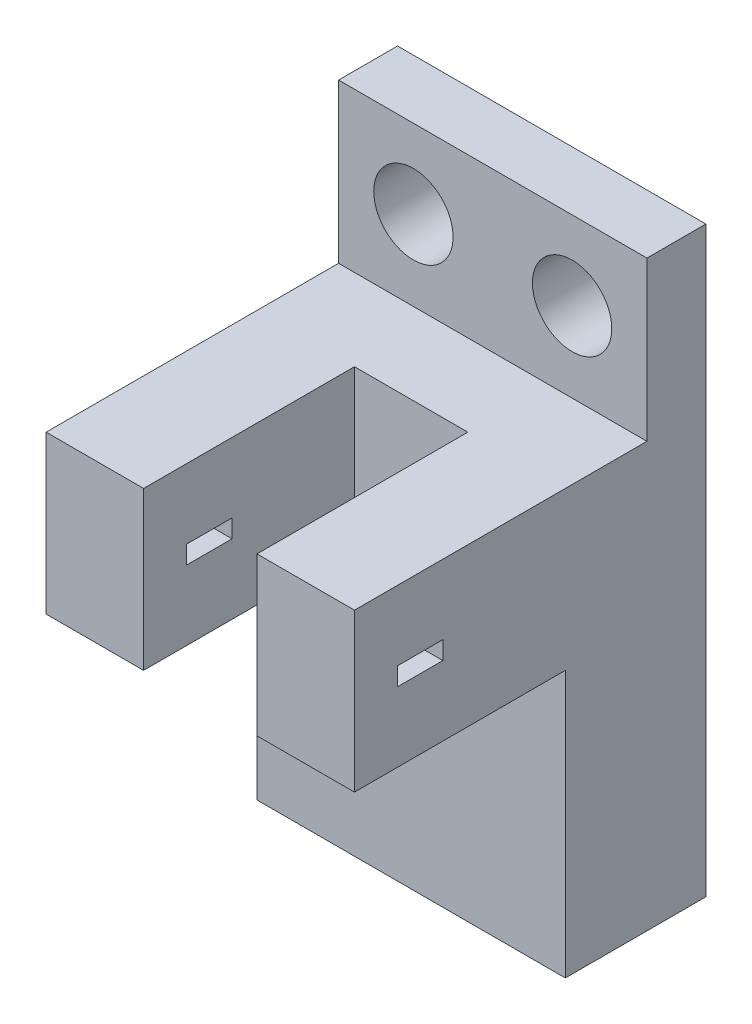
ISO-10303-21;
HEADER;
FILE_DESCRIPTION(('STEP AP214'),'2;1');
FILE_NAME('part.step','',(''),(''),'','','');
FILE_SCHEMA(('AUTOMOTIVE_DESIGN { 1 0 10303 214 1 1 1 1 }'));
ENDSEC;
DATA;
#1=APPLICATION_CONTEXT('core data for automotive mechanical design processes');
#2=APPLICATION_PROTOCOL_DEFINITION('international standard','automotive_design',2000,#1);
#3=PRODUCT_CONTEXT('',#1,'mechanical');
#4=PRODUCT('Part','Part','',(#3));
#5=PRODUCT_RELATED_PRODUCT_CATEGORY('part','',(#4));
#6=PRODUCT_DEFINITION_FORMATION('','',#4);
#7=PRODUCT_DEFINITION_CONTEXT('part definition',#1,'design');
#8=PRODUCT_DEFINITION('design','',#6,#7);
#9=PRODUCT_DEFINITION_SHAPE('','',#8);
#10=(LENGTH_UNIT() NAMED_UNIT(*) SI_UNIT(.MILLI.,.METRE.));
#11=(NAMED_UNIT(*) PLANE_ANGLE_UNIT() SI_UNIT($,.RADIAN.));
#12=(NAMED_UNIT(*) SI_UNIT($,.STERADIAN.) SOLID_ANGLE_UNIT());
#13=UNCERTAINTY_MEASURE_WITH_UNIT(LENGTH_MEASURE(1.E-05),#10,'distance_accuracy_value','');
#14=(GEOMETRIC_REPRESENTATION_CONTEXT(3) GLOBAL_UNCERTAINTY_ASSIGNED_CONTEXT((#13)) GLOBAL_UNIT_ASSIGNED_CONTEXT((#10,
#11,#12)) REPRESENTATION_CONTEXT('',''));
#15=CARTESIAN_POINT('',(0.,0.,0.));
#16=DIRECTION('',(0.,0.,1.));
#17=DIRECTION('',(1.,0.,0.));
#18=AXIS2_PLACEMENT_3D('',#15,#16,#17);
#19=CARTESIAN_POINT('',(0.,0.,6.2));
#20=DIRECTION('',(0.,0.,-1.));
#21=DIRECTION('',(-1.,0.,0.));
#22=AXIS2_PLACEMENT_3D('',#19,#20,#21);
#23=PLANE('',#22);
#24=DIRECTION('',(0.,-1.,0.));
#25=VECTOR('',#24,1.);
#26=CARTESIAN_POINT('',(2.5,1.65,6.2));
#27=LINE('',#26,#25);
#28=CARTESIAN_POINT('',(2.5,8.6,6.2));
#29=VERTEX_POINT('',#28);
#30=CARTESIAN_POINT('',(2.5,1.65,6.2));
#31=VERTEX_POINT('',#30);
#32=EDGE_CURVE('E258',#29,#31,#27,.T.);
#33=ORIENTED_EDGE('',*,*,#32,.F.);
#34=DIRECTION('',(-1.,0.,0.));
#35=VECTOR('',#34,1.);
#36=CARTESIAN_POINT('',(-6.8,8.6,6.2));
#37=LINE('',#36,#35);
#38=CARTESIAN_POINT('',(-2.5,8.6,6.2));
#39=VERTEX_POINT('',#38);
#40=EDGE_CURVE('E312',#29,#39,#37,.T.);
#41=ORIENTED_EDGE('',*,*,#40,.T.);
#42=DIRECTION('',(0.,1.,0.));
#43=VECTOR('',#42,1.);
#44=CARTESIAN_POINT('',(-2.5,1.65,6.2));
#45=LINE('',#44,#43);
#46=CARTESIAN_POINT('',(-2.5,1.65,6.2));
#47=VERTEX_POINT('',#46);
#48=EDGE_CURVE('E284',#47,#39,#45,.T.);
#49=ORIENTED_EDGE('',*,*,#48,.F.);
#50=DIRECTION('',(1.,0.,0.));
#51=VECTOR('',#50,1.);
#52=CARTESIAN_POINT('',(-6.8,1.65,6.2));
#53=LINE('',#52,#51);
#54=CARTESIAN_POINT('',(-6.8,1.65,6.2));
#55=VERTEX_POINT('',#54);
#56=EDGE_CURVE('E289',#55,#47,#53,.T.);
#57=ORIENTED_EDGE('',*,*,#56,.F.);
#58=DIRECTION('',(0.,-1.,0.));
#59=VECTOR('',#58,1.);
#60=CARTESIAN_POINT('',(-6.8,-10.1,6.2));
#61=LINE('',#60,#59);
#62=CARTESIAN_POINT('',(-6.8,-10.1,6.2));
#63=VERTEX_POINT('',#62);
#64=EDGE_CURVE('E315',#55,#63,#61,.T.);
#65=ORIENTED_EDGE('',*,*,#64,.T.);
#66=DIRECTION('',(1.,0.,0.));
#67=VECTOR('',#66,1.);
#68=CARTESIAN_POINT('',(-6.8,-10.1,6.2));
#69=LINE('',#68,#67);
#70=CARTESIAN_POINT('',(6.8,-10.1,6.2));
#71=VERTEX_POINT('',#70);
#72=EDGE_CURVE('E317',#63,#71,#69,.T.);
#73=ORIENTED_EDGE('',*,*,#72,.T.);
#74=DIRECTION('',(0.,1.,0.));
#75=VECTOR('',#74,1.);
#76=CARTESIAN_POINT('',(6.8,-10.1,6.2));
#77=LINE('',#76,#75);
#78=CARTESIAN_POINT('',(6.8,1.65,6.2));
#79=VERTEX_POINT('',#78);
#80=EDGE_CURVE('E310',#71,#79,#77,.T.);
#81=ORIENTED_EDGE('',*,*,#80,.T.);
#82=DIRECTION('',(1.,0.,0.));
#83=VECTOR('',#82,1.);
#84=CARTESIAN_POINT('',(2.5,1.65,6.2));
#85=LINE('',#84,#83);
#86=EDGE_CURVE('E265',#31,#79,#85,.T.);
#87=ORIENTED_EDGE('',*,*,#86,.F.);
#88=EDGE_LOOP('',(#33,#41,#49,#57,#65,#73,#81,#87));
#89=FACE_BOUND('',#88,.T.);
#90=ADVANCED_FACE('F34',(#89),#23,.F.);
#91=CARTESIAN_POINT('',(6.8,-10.1,6.2));
#92=DIRECTION('',(-1.,0.,0.));
#93=DIRECTION('',(0.,0.,1.));
#94=AXIS2_PLACEMENT_3D('',#91,#92,#93);
#95=PLANE('',#94);
#96=DIRECTION('',(0.,0.,1.));
#97=VECTOR('',#96,1.);
#98=CARTESIAN_POINT('',(6.8,5.525,13.6));
#99=LINE('',#98,#97);
#100=CARTESIAN_POINT('',(6.8,5.525,11.6));
#101=VERTEX_POINT('',#100);
#102=CARTESIAN_POINT('',(6.8,5.525,13.6));
#103=VERTEX_POINT('',#102);
#104=EDGE_CURVE('E206',#101,#103,#99,.T.);
#105=ORIENTED_EDGE('',*,*,#104,.F.);
#106=DIRECTION('',(0.,1.,0.));
#107=VECTOR('',#106,1.);
#108=CARTESIAN_POINT('',(6.8,4.725,11.6));
#109=LINE('',#108,#107);
#110=CARTESIAN_POINT('',(6.8,4.725,11.6));
#111=VERTEX_POINT('',#110);
#112=EDGE_CURVE('E49',#111,#101,#109,.T.);
#113=ORIENTED_EDGE('',*,*,#112,.F.);
#114=DIRECTION('',(0.,0.,-1.));
#115=VECTOR('',#114,1.);
#116=CARTESIAN_POINT('',(6.8,4.725,13.6));
#117=LINE('',#116,#115);
#118=CARTESIAN_POINT('',(6.8,4.725,13.6));
#119=VERTEX_POINT('',#118);
#120=EDGE_CURVE('E197',#119,#111,#117,.T.);
#121=ORIENTED_EDGE('',*,*,#120,.F.);
#122=DIRECTION('',(0.,-1.,0.));
#123=VECTOR('',#122,1.);
#124=CARTESIAN_POINT('',(6.8,4.725,13.6));
#125=LINE('',#124,#123);
#126=EDGE_CURVE('E200',#103,#119,#125,.T.);
#127=ORIENTED_EDGE('',*,*,#126,.F.);
#128=EDGE_LOOP('',(#105,#113,#121,#127));
#129=FACE_BOUND('',#128,.T.);
#130=DIRECTION('',(0.,1.,0.));
#131=VECTOR('',#130,1.);
#132=CARTESIAN_POINT('',(6.8,-10.1,0.));
#133=LINE('',#132,#131);
#134=CARTESIAN_POINT('',(6.8,-10.1,0.));
#135=VERTEX_POINT('',#134);
#136=CARTESIAN_POINT('',(6.8,15.6,0.));
#137=VERTEX_POINT('',#136);
#138=EDGE_CURVE('E309',#135,#137,#133,.T.);
#139=ORIENTED_EDGE('',*,*,#138,.T.);
#140=DIRECTION('',(0.,0.,-1.));
#141=VECTOR('',#140,1.);
#142=CARTESIAN_POINT('',(6.8,15.6,2.6));
#143=LINE('',#142,#141);
#144=CARTESIAN_POINT('',(6.8,15.6,2.6));
#145=VERTEX_POINT('',#144);
#146=EDGE_CURVE('E255',#145,#137,#143,.T.);
#147=ORIENTED_EDGE('',*,*,#146,.F.);
#148=DIRECTION('',(0.,-1.,0.));
#149=VECTOR('',#148,1.);
#150=CARTESIAN_POINT('',(6.8,15.6,2.6));
#151=LINE('',#150,#149);
#152=CARTESIAN_POINT('',(6.8,8.6,2.6));
#153=VERTEX_POINT('',#152);
#154=EDGE_CURVE('E247',#145,#153,#151,.T.);
#155=ORIENTED_EDGE('',*,*,#154,.T.);
#156=DIRECTION('',(0.,0.,-1.));
#157=VECTOR('',#156,1.);
#158=CARTESIAN_POINT('',(6.8,8.6,6.2));
#159=LINE('',#158,#157);
#160=CARTESIAN_POINT('',(6.8,8.6,15.5));
#161=VERTEX_POINT('',#160);
#162=EDGE_CURVE('E332',#161,#153,#159,.T.);
#163=ORIENTED_EDGE('',*,*,#162,.F.);
#164=DIRECTION('',(0.,1.,0.));
#165=VECTOR('',#164,1.);
#166=CARTESIAN_POINT('',(6.8,1.65,15.5));
#167=LINE('',#166,#165);
#168=CARTESIAN_POINT('',(6.8,1.65,15.5));
#169=VERTEX_POINT('',#168);
#170=EDGE_CURVE('E261',#169,#161,#167,.T.);
#171=ORIENTED_EDGE('',*,*,#170,.F.);
#172=DIRECTION('',(0.,0.,-1.));
#173=VECTOR('',#172,1.);
#174=CARTESIAN_POINT('',(6.8,1.65,15.5));
#175=LINE('',#174,#173);
#176=EDGE_CURVE('E271',#169,#79,#175,.T.);
#177=ORIENTED_EDGE('',*,*,#176,.T.);
#178=ORIENTED_EDGE('',*,*,#80,.F.);
#179=DIRECTION('',(0.,0.,-1.));
#180=VECTOR('',#179,1.);
#181=CARTESIAN_POINT('',(6.8,-10.1,6.2));
#182=LINE('',#181,#180);
#183=EDGE_CURVE('E319',#71,#135,#182,.T.);
#184=ORIENTED_EDGE('',*,*,#183,.T.);
#185=EDGE_LOOP('',(#139,#147,#155,#163,#171,#177,#178,#184));
#186=FACE_BOUND('',#185,.T.);
#187=ADVANCED_FACE('F36',(#129,#186),#95,.F.);
#188=CARTESIAN_POINT('',(-6.8,8.6,6.2));
#189=DIRECTION('',(0.,-1.,0.));
#190=DIRECTION('',(0.,0.,-1.));
#191=AXIS2_PLACEMENT_3D('',#188,#189,#190);
#192=PLANE('',#191);
#193=ORIENTED_EDGE('',*,*,#162,.T.);
#194=DIRECTION('',(-1.,0.,0.));
#195=VECTOR('',#194,1.);
#196=CARTESIAN_POINT('',(6.8,8.6,2.6));
#197=LINE('',#196,#195);
#198=CARTESIAN_POINT('',(-6.8,8.6,2.6));
#199=VERTEX_POINT('',#198);
#200=EDGE_CURVE('E249',#153,#199,#197,.T.);
#201=ORIENTED_EDGE('',*,*,#200,.T.);
#202=DIRECTION('',(0.,0.,-1.));
#203=VECTOR('',#202,1.);
#204=CARTESIAN_POINT('',(-6.8,8.6,6.2));
#205=LINE('',#204,#203);
#206=CARTESIAN_POINT('',(-6.8,8.6,15.5));
#207=VERTEX_POINT('',#206);
#208=EDGE_CURVE('E329',#207,#199,#205,.T.);
#209=ORIENTED_EDGE('',*,*,#208,.F.);
#210=DIRECTION('',(-1.,0.,0.));
#211=VECTOR('',#210,1.);
#212=CARTESIAN_POINT('',(-6.8,8.6,15.5));
#213=LINE('',#212,#211);
#214=CARTESIAN_POINT('',(-2.5,8.6,15.5));
#215=VERTEX_POINT('',#214);
#216=EDGE_CURVE('E288',#215,#207,#213,.T.);
#217=ORIENTED_EDGE('',*,*,#216,.F.);
#218=DIRECTION('',(0.,0.,-1.));
#219=VECTOR('',#218,1.);
#220=CARTESIAN_POINT('',(-2.5,8.6,15.5));
#221=LINE('',#220,#219);
#222=EDGE_CURVE('E306',#215,#39,#221,.T.);
#223=ORIENTED_EDGE('',*,*,#222,.T.);
#224=ORIENTED_EDGE('',*,*,#40,.F.);
#225=DIRECTION('',(0.,0.,-1.));
#226=VECTOR('',#225,1.);
#227=CARTESIAN_POINT('',(2.5,8.6,15.5));
#228=LINE('',#227,#226);
#229=CARTESIAN_POINT('',(2.5,8.6,15.5));
#230=VERTEX_POINT('',#229);
#231=EDGE_CURVE('E281',#230,#29,#228,.T.);
#232=ORIENTED_EDGE('',*,*,#231,.F.);
#233=DIRECTION('',(-1.,0.,0.));
#234=VECTOR('',#233,1.);
#235=CARTESIAN_POINT('',(2.5,8.6,15.5));
#236=LINE('',#235,#234);
#237=EDGE_CURVE('E264',#161,#230,#236,.T.);
#238=ORIENTED_EDGE('',*,*,#237,.F.);
#239=EDGE_LOOP('',(#193,#201,#209,#217,#223,#224,#232,#238));
#240=FACE_BOUND('',#239,.T.);
#241=ADVANCED_FACE('F375',(#240),#192,.F.);
#242=CARTESIAN_POINT('',(-6.8,-10.1,6.2));
#243=DIRECTION('',(1.,0.,0.));
#244=DIRECTION('',(0.,0.,-1.));
#245=AXIS2_PLACEMENT_3D('',#242,#243,#244);
#246=PLANE('',#245);
#247=DIRECTION('',(0.,0.,-1.));
#248=VECTOR('',#247,1.);
#249=CARTESIAN_POINT('',(-6.8,4.725,13.6));
#250=LINE('',#249,#248);
#251=CARTESIAN_POINT('',(-6.8,4.725,13.6));
#252=VERTEX_POINT('',#251);
#253=CARTESIAN_POINT('',(-6.8,4.725,11.6));
#254=VERTEX_POINT('',#253);
#255=EDGE_CURVE('E196',#252,#254,#250,.T.);
#256=ORIENTED_EDGE('',*,*,#255,.T.);
#257=DIRECTION('',(0.,1.,0.));
#258=VECTOR('',#257,1.);
#259=CARTESIAN_POINT('',(-6.8,4.725,11.6));
#260=LINE('',#259,#258);
#261=CARTESIAN_POINT('',(-6.8,5.525,11.6));
#262=VERTEX_POINT('',#261);
#263=EDGE_CURVE('E178',#254,#262,#260,.T.);
#264=ORIENTED_EDGE('',*,*,#263,.T.);
#265=DIRECTION('',(0.,0.,1.));
#266=VECTOR('',#265,1.);
#267=CARTESIAN_POINT('',(-6.8,5.525,13.6));
#268=LINE('',#267,#266);
#269=CARTESIAN_POINT('',(-6.8,5.525,13.6));
#270=VERTEX_POINT('',#269);
#271=EDGE_CURVE('E188',#262,#270,#268,.T.);
#272=ORIENTED_EDGE('',*,*,#271,.T.);
#273=DIRECTION('',(0.,-1.,0.));
#274=VECTOR('',#273,1.);
#275=CARTESIAN_POINT('',(-6.8,4.725,13.6));
#276=LINE('',#275,#274);
#277=EDGE_CURVE('E57',#270,#252,#276,.T.);
#278=ORIENTED_EDGE('',*,*,#277,.T.);
#279=EDGE_LOOP('',(#256,#264,#272,#278));
#280=FACE_BOUND('',#279,.T.);
#281=DIRECTION('',(0.,-1.,0.));
#282=VECTOR('',#281,1.);
#283=CARTESIAN_POINT('',(-6.8,-10.1,0.));
#284=LINE('',#283,#282);
#285=CARTESIAN_POINT('',(-6.8,15.6,0.));
#286=VERTEX_POINT('',#285);
#287=CARTESIAN_POINT('',(-6.8,-10.1,0.));
#288=VERTEX_POINT('',#287);
#289=EDGE_CURVE('E321',#286,#288,#284,.T.);
#290=ORIENTED_EDGE('',*,*,#289,.T.);
#291=DIRECTION('',(0.,0.,-1.));
#292=VECTOR('',#291,1.);
#293=CARTESIAN_POINT('',(-6.8,-10.1,6.2));
#294=LINE('',#293,#292);
#295=EDGE_CURVE('E326',#63,#288,#294,.T.);
#296=ORIENTED_EDGE('',*,*,#295,.F.);
#297=ORIENTED_EDGE('',*,*,#64,.F.);
#298=DIRECTION('',(0.,0.,-1.));
#299=VECTOR('',#298,1.);
#300=CARTESIAN_POINT('',(-6.8,1.65,15.5));
#301=LINE('',#300,#299);
#302=CARTESIAN_POINT('',(-6.8,1.65,15.5));
#303=VERTEX_POINT('',#302);
#304=EDGE_CURVE('E303',#303,#55,#301,.T.);
#305=ORIENTED_EDGE('',*,*,#304,.F.);
#306=DIRECTION('',(0.,-1.,0.));
#307=VECTOR('',#306,1.);
#308=CARTESIAN_POINT('',(-6.8,1.65,15.5));
#309=LINE('',#308,#307);
#310=EDGE_CURVE('E292',#207,#303,#309,.T.);
#311=ORIENTED_EDGE('',*,*,#310,.F.);
#312=ORIENTED_EDGE('',*,*,#208,.T.);
#313=DIRECTION('',(0.,1.,0.));
#314=VECTOR('',#313,1.);
#315=CARTESIAN_POINT('',(-6.8,15.6,2.6));
#316=LINE('',#315,#314);
#317=CARTESIAN_POINT('',(-6.8,15.6,2.6));
#318=VERTEX_POINT('',#317);
#319=EDGE_CURVE('E241',#199,#318,#316,.T.);
#320=ORIENTED_EDGE('',*,*,#319,.T.);
#321=DIRECTION('',(0.,0.,-1.));
#322=VECTOR('',#321,1.);
#323=CARTESIAN_POINT('',(-6.8,15.6,2.6));
#324=LINE('',#323,#322);
#325=EDGE_CURVE('E252',#318,#286,#324,.T.);
#326=ORIENTED_EDGE('',*,*,#325,.T.);
#327=EDGE_LOOP('',(#290,#296,#297,#305,#311,#312,#320,#326));
#328=FACE_BOUND('',#327,.T.);
#329=ADVANCED_FACE('F193',(#280,#328),#246,.F.);
#330=CARTESIAN_POINT('',(-6.8,-10.1,6.2));
#331=DIRECTION('',(0.,1.,0.));
#332=DIRECTION('',(0.,0.,1.));
#333=AXIS2_PLACEMENT_3D('',#330,#331,#332);
#334=PLANE('',#333);
#335=DIRECTION('',(1.,0.,0.));
#336=VECTOR('',#335,1.);
#337=CARTESIAN_POINT('',(-6.8,-10.1,0.));
#338=LINE('',#337,#336);
#339=EDGE_CURVE('E313',#288,#135,#338,.T.);
#340=ORIENTED_EDGE('',*,*,#339,.T.);
#341=ORIENTED_EDGE('',*,*,#183,.F.);
#342=ORIENTED_EDGE('',*,*,#72,.F.);
#343=ORIENTED_EDGE('',*,*,#295,.T.);
#344=EDGE_LOOP('',(#340,#341,#342,#343));
#345=FACE_BOUND('',#344,.T.);
#346=ADVANCED_FACE('F384',(#345),#334,.F.);
#347=CARTESIAN_POINT('',(0.,0.,0.));
#348=DIRECTION('',(0.,0.,-1.));
#349=DIRECTION('',(-1.,0.,0.));
#350=AXIS2_PLACEMENT_3D('',#347,#348,#349);
#351=PLANE('',#350);
#352=ORIENTED_EDGE('',*,*,#138,.F.);
#353=ORIENTED_EDGE('',*,*,#339,.F.);
#354=ORIENTED_EDGE('',*,*,#289,.F.);
#355=DIRECTION('',(1.,0.,0.));
#356=VECTOR('',#355,1.);
#357=CARTESIAN_POINT('',(6.8,15.6,0.));
#358=LINE('',#357,#356);
#359=EDGE_CURVE('E238',#286,#137,#358,.T.);
#360=ORIENTED_EDGE('',*,*,#359,.T.);
#361=EDGE_LOOP('',(#352,#353,#354,#360));
#362=FACE_BOUND('',#361,.T.);
#363=CARTESIAN_POINT('',(3.5,12.125,0.));
#364=DIRECTION('',(0.,0.,-1.));
#365=DIRECTION('',(-1.,0.,0.));
#366=AXIS2_PLACEMENT_3D('',#363,#364,#365);
#367=CIRCLE('',#366,1.75);
#368=CARTESIAN_POINT('',(1.75,12.125,0.));
#369=VERTEX_POINT('',#368);
#370=EDGE_CURVE('E228',#369,#369,#367,.T.);
#371=ORIENTED_EDGE('',*,*,#370,.F.);
#372=EDGE_LOOP('',(#371));
#373=FACE_BOUND('',#372,.T.);
#374=CARTESIAN_POINT('',(-3.5,12.125,0.));
#375=DIRECTION('',(0.,0.,-1.));
#376=DIRECTION('',(-1.,0.,0.));
#377=AXIS2_PLACEMENT_3D('',#374,#375,#376);
#378=CIRCLE('',#377,1.75);
#379=CARTESIAN_POINT('',(-5.25,12.125,0.));
#380=VERTEX_POINT('',#379);
#381=EDGE_CURVE('E232',#380,#380,#378,.T.);
#382=ORIENTED_EDGE('',*,*,#381,.F.);
#383=EDGE_LOOP('',(#382));
#384=FACE_BOUND('',#383,.T.);
#385=ADVANCED_FACE('F381',(#362,#373,#384),#351,.T.);
#386=CARTESIAN_POINT('',(-2.5,1.65,15.5));
#387=DIRECTION('',(-1.,0.,0.));
#388=DIRECTION('',(0.,0.,1.));
#389=AXIS2_PLACEMENT_3D('',#386,#387,#388);
#390=PLANE('',#389);
#391=DIRECTION('',(0.,0.,-1.));
#392=VECTOR('',#391,1.);
#393=CARTESIAN_POINT('',(-2.5,5.525,15.5));
#394=LINE('',#393,#392);
#395=CARTESIAN_POINT('',(-2.5,5.525,13.6));
#396=VERTEX_POINT('',#395);
#397=CARTESIAN_POINT('',(-2.5,5.525,11.6));
#398=VERTEX_POINT('',#397);
#399=EDGE_CURVE('E213',#396,#398,#394,.T.);
#400=ORIENTED_EDGE('',*,*,#399,.T.);
#401=DIRECTION('',(0.,-1.,0.));
#402=VECTOR('',#401,1.);
#403=CARTESIAN_POINT('',(-2.5,1.65,11.6));
#404=LINE('',#403,#402);
#405=CARTESIAN_POINT('',(-2.5,4.725,11.6));
#406=VERTEX_POINT('',#405);
#407=EDGE_CURVE('E181',#398,#406,#404,.T.);
#408=ORIENTED_EDGE('',*,*,#407,.T.);
#409=DIRECTION('',(0.,0.,1.));
#410=VECTOR('',#409,1.);
#411=CARTESIAN_POINT('',(-2.5,4.725,15.5));
#412=LINE('',#411,#410);
#413=CARTESIAN_POINT('',(-2.5,4.725,13.6));
#414=VERTEX_POINT('',#413);
#415=EDGE_CURVE('E224',#406,#414,#412,.T.);
#416=ORIENTED_EDGE('',*,*,#415,.T.);
#417=DIRECTION('',(0.,1.,0.));
#418=VECTOR('',#417,1.);
#419=CARTESIAN_POINT('',(-2.5,1.65,13.6));
#420=LINE('',#419,#418);
#421=EDGE_CURVE('E221',#414,#396,#420,.T.);
#422=ORIENTED_EDGE('',*,*,#421,.T.);
#423=EDGE_LOOP('',(#400,#408,#416,#422));
#424=FACE_BOUND('',#423,.T.);
#425=ORIENTED_EDGE('',*,*,#48,.T.);
#426=ORIENTED_EDGE('',*,*,#222,.F.);
#427=DIRECTION('',(0.,1.,0.));
#428=VECTOR('',#427,1.);
#429=CARTESIAN_POINT('',(-2.5,1.65,15.5));
#430=LINE('',#429,#428);
#431=CARTESIAN_POINT('',(-2.5,1.65,15.5));
#432=VERTEX_POINT('',#431);
#433=EDGE_CURVE('E285',#432,#215,#430,.T.);
#434=ORIENTED_EDGE('',*,*,#433,.F.);
#435=DIRECTION('',(0.,0.,-1.));
#436=VECTOR('',#435,1.);
#437=CARTESIAN_POINT('',(-2.5,1.65,15.5));
#438=LINE('',#437,#436);
#439=EDGE_CURVE('E296',#432,#47,#438,.T.);
#440=ORIENTED_EDGE('',*,*,#439,.T.);
#441=EDGE_LOOP('',(#425,#426,#434,#440));
#442=FACE_BOUND('',#441,.T.);
#443=ADVANCED_FACE('F379',(#424,#442),#390,.F.);
#444=CARTESIAN_POINT('',(-6.8,1.65,15.5));
#445=DIRECTION('',(0.,1.,0.));
#446=DIRECTION('',(0.,0.,1.));
#447=AXIS2_PLACEMENT_3D('',#444,#445,#446);
#448=PLANE('',#447);
#449=ORIENTED_EDGE('',*,*,#56,.T.);
#450=ORIENTED_EDGE('',*,*,#439,.F.);
#451=DIRECTION('',(1.,0.,0.));
#452=VECTOR('',#451,1.);
#453=CARTESIAN_POINT('',(-6.8,1.65,15.5));
#454=LINE('',#453,#452);
#455=EDGE_CURVE('E294',#303,#432,#454,.T.);
#456=ORIENTED_EDGE('',*,*,#455,.F.);
#457=ORIENTED_EDGE('',*,*,#304,.T.);
#458=EDGE_LOOP('',(#449,#450,#456,#457));
#459=FACE_BOUND('',#458,.T.);
#460=ADVANCED_FACE('F447',(#459),#448,.F.);
#461=CARTESIAN_POINT('',(0.,0.,15.5));
#462=DIRECTION('',(0.,0.,-1.));
#463=DIRECTION('',(-1.,0.,0.));
#464=AXIS2_PLACEMENT_3D('',#461,#462,#463);
#465=PLANE('',#464);
#466=ORIENTED_EDGE('',*,*,#433,.T.);
#467=ORIENTED_EDGE('',*,*,#216,.T.);
#468=ORIENTED_EDGE('',*,*,#310,.T.);
#469=ORIENTED_EDGE('',*,*,#455,.T.);
#470=EDGE_LOOP('',(#466,#467,#468,#469));
#471=FACE_BOUND('',#470,.T.);
#472=ADVANCED_FACE('F406',(#471),#465,.F.);
#473=CARTESIAN_POINT('',(2.5,1.65,15.5));
#474=DIRECTION('',(1.,0.,0.));
#475=DIRECTION('',(0.,0.,-1.));
#476=AXIS2_PLACEMENT_3D('',#473,#474,#475);
#477=PLANE('',#476);
#478=DIRECTION('',(0.,0.,-1.));
#479=VECTOR('',#478,1.);
#480=CARTESIAN_POINT('',(2.5,4.725,15.5));
#481=LINE('',#480,#479);
#482=CARTESIAN_POINT('',(2.5,4.725,13.6));
#483=VERTEX_POINT('',#482);
#484=CARTESIAN_POINT('',(2.5,4.725,11.6));
#485=VERTEX_POINT('',#484);
#486=EDGE_CURVE('E42',#483,#485,#481,.T.);
#487=ORIENTED_EDGE('',*,*,#486,.T.);
#488=DIRECTION('',(0.,1.,0.));
#489=VECTOR('',#488,1.);
#490=CARTESIAN_POINT('',(2.5,1.65,11.6));
#491=LINE('',#490,#489);
#492=CARTESIAN_POINT('',(2.5,5.525,11.6));
#493=VERTEX_POINT('',#492);
#494=EDGE_CURVE('E11',#485,#493,#491,.T.);
#495=ORIENTED_EDGE('',*,*,#494,.T.);
#496=DIRECTION('',(0.,0.,1.));
#497=VECTOR('',#496,1.);
#498=CARTESIAN_POINT('',(2.5,5.525,15.5));
#499=LINE('',#498,#497);
#500=CARTESIAN_POINT('',(2.5,5.525,13.6));
#501=VERTEX_POINT('',#500);
#502=EDGE_CURVE('E335',#493,#501,#499,.T.);
#503=ORIENTED_EDGE('',*,*,#502,.T.);
#504=DIRECTION('',(0.,-1.,0.));
#505=VECTOR('',#504,1.);
#506=CARTESIAN_POINT('',(2.5,1.65,13.6));
#507=LINE('',#506,#505);
#508=EDGE_CURVE('E338',#501,#483,#507,.T.);
#509=ORIENTED_EDGE('',*,*,#508,.T.);
#510=EDGE_LOOP('',(#487,#495,#503,#509));
#511=FACE_BOUND('',#510,.T.);
#512=ORIENTED_EDGE('',*,*,#32,.T.);
#513=DIRECTION('',(0.,0.,-1.));
#514=VECTOR('',#513,1.);
#515=CARTESIAN_POINT('',(2.5,1.65,15.5));
#516=LINE('',#515,#514);
#517=CARTESIAN_POINT('',(2.5,1.65,15.5));
#518=VERTEX_POINT('',#517);
#519=EDGE_CURVE('E278',#518,#31,#516,.T.);
#520=ORIENTED_EDGE('',*,*,#519,.F.);
#521=DIRECTION('',(0.,-1.,0.));
#522=VECTOR('',#521,1.);
#523=CARTESIAN_POINT('',(2.5,1.65,15.5));
#524=LINE('',#523,#522);
#525=EDGE_CURVE('E267',#230,#518,#524,.T.);
#526=ORIENTED_EDGE('',*,*,#525,.F.);
#527=ORIENTED_EDGE('',*,*,#231,.T.);
#528=EDGE_LOOP('',(#512,#520,#526,#527));
#529=FACE_BOUND('',#528,.T.);
#530=ADVANCED_FACE('F342',(#511,#529),#477,.F.);
#531=CARTESIAN_POINT('',(2.5,1.65,15.5));
#532=DIRECTION('',(0.,1.,0.));
#533=DIRECTION('',(0.,0.,1.));
#534=AXIS2_PLACEMENT_3D('',#531,#532,#533);
#535=PLANE('',#534);
#536=ORIENTED_EDGE('',*,*,#86,.T.);
#537=ORIENTED_EDGE('',*,*,#176,.F.);
#538=DIRECTION('',(1.,0.,0.));
#539=VECTOR('',#538,1.);
#540=CARTESIAN_POINT('',(2.5,1.65,15.5));
#541=LINE('',#540,#539);
#542=EDGE_CURVE('E269',#518,#169,#541,.T.);
#543=ORIENTED_EDGE('',*,*,#542,.F.);
#544=ORIENTED_EDGE('',*,*,#519,.T.);
#545=EDGE_LOOP('',(#536,#537,#543,#544));
#546=FACE_BOUND('',#545,.T.);
#547=ADVANCED_FACE('F419',(#546),#535,.F.);
#548=CARTESIAN_POINT('',(0.,0.,15.5));
#549=DIRECTION('',(0.,0.,-1.));
#550=DIRECTION('',(-1.,0.,0.));
#551=AXIS2_PLACEMENT_3D('',#548,#549,#550);
#552=PLANE('',#551);
#553=ORIENTED_EDGE('',*,*,#170,.T.);
#554=ORIENTED_EDGE('',*,*,#237,.T.);
#555=ORIENTED_EDGE('',*,*,#525,.T.);
#556=ORIENTED_EDGE('',*,*,#542,.T.);
#557=EDGE_LOOP('',(#553,#554,#555,#556));
#558=FACE_BOUND('',#557,.T.);
#559=ADVANCED_FACE('F416',(#558),#552,.F.);
#560=CARTESIAN_POINT('',(6.8,15.6,2.6));
#561=DIRECTION('',(0.,1.,0.));
#562=DIRECTION('',(0.,0.,1.));
#563=AXIS2_PLACEMENT_3D('',#560,#561,#562);
#564=PLANE('',#563);
#565=ORIENTED_EDGE('',*,*,#359,.F.);
#566=ORIENTED_EDGE('',*,*,#325,.F.);
#567=DIRECTION('',(1.,0.,0.));
#568=VECTOR('',#567,1.);
#569=CARTESIAN_POINT('',(6.8,15.6,2.6));
#570=LINE('',#569,#568);
#571=EDGE_CURVE('E244',#318,#145,#570,.T.);
#572=ORIENTED_EDGE('',*,*,#571,.T.);
#573=ORIENTED_EDGE('',*,*,#146,.T.);
#574=EDGE_LOOP('',(#565,#566,#572,#573));
#575=FACE_BOUND('',#574,.T.);
#576=ADVANCED_FACE('F429',(#575),#564,.T.);
#577=CARTESIAN_POINT('',(0.,0.,2.6));
#578=DIRECTION('',(0.,0.,-1.));
#579=DIRECTION('',(-1.,0.,0.));
#580=AXIS2_PLACEMENT_3D('',#577,#578,#579);
#581=PLANE('',#580);
#582=CARTESIAN_POINT('',(3.5,12.125,2.6));
#583=DIRECTION('',(0.,0.,-1.));
#584=DIRECTION('',(-1.,0.,0.));
#585=AXIS2_PLACEMENT_3D('',#582,#583,#584);
#586=CIRCLE('',#585,1.75);
#587=CARTESIAN_POINT('',(1.75,12.125,2.6));
#588=VERTEX_POINT('',#587);
#589=EDGE_CURVE('E229',#588,#588,#586,.T.);
#590=ORIENTED_EDGE('',*,*,#589,.T.);
#591=EDGE_LOOP('',(#590));
#592=FACE_BOUND('',#591,.T.);
#593=CARTESIAN_POINT('',(-3.5,12.125,2.6));
#594=DIRECTION('',(0.,0.,-1.));
#595=DIRECTION('',(-1.,0.,0.));
#596=AXIS2_PLACEMENT_3D('',#593,#594,#595);
#597=CIRCLE('',#596,1.75);
#598=CARTESIAN_POINT('',(-5.25,12.125,2.6));
#599=VERTEX_POINT('',#598);
#600=EDGE_CURVE('E235',#599,#599,#597,.T.);
#601=ORIENTED_EDGE('',*,*,#600,.T.);
#602=EDGE_LOOP('',(#601));
#603=FACE_BOUND('',#602,.T.);
#604=ORIENTED_EDGE('',*,*,#319,.F.);
#605=ORIENTED_EDGE('',*,*,#200,.F.);
#606=ORIENTED_EDGE('',*,*,#154,.F.);
#607=ORIENTED_EDGE('',*,*,#571,.F.);
#608=EDGE_LOOP('',(#604,#605,#606,#607));
#609=FACE_BOUND('',#608,.T.);
#610=ADVANCED_FACE('F401',(#592,#603,#609),#581,.F.);
#611=CARTESIAN_POINT('',(-3.5,12.125,2.6));
#612=DIRECTION('',(0.,0.,-1.));
#613=DIRECTION('',(-1.,0.,0.));
#614=AXIS2_PLACEMENT_3D('',#611,#612,#613);
#615=CYLINDRICAL_SURFACE('',#614,1.75);
#616=ORIENTED_EDGE('',*,*,#600,.F.);
#617=EDGE_LOOP('',(#616));
#618=FACE_BOUND('',#617,.T.);
#619=ORIENTED_EDGE('',*,*,#381,.T.);
#620=EDGE_LOOP('',(#619));
#621=FACE_BOUND('',#620,.T.);
#622=ADVANCED_FACE('F436',(#618,#621),#615,.F.);
#623=CARTESIAN_POINT('',(3.5,12.125,2.6));
#624=DIRECTION('',(0.,0.,-1.));
#625=DIRECTION('',(-1.,0.,0.));
#626=AXIS2_PLACEMENT_3D('',#623,#624,#625);
#627=CYLINDRICAL_SURFACE('',#626,1.75);
#628=ORIENTED_EDGE('',*,*,#589,.F.);
#629=EDGE_LOOP('',(#628));
#630=FACE_BOUND('',#629,.T.);
#631=ORIENTED_EDGE('',*,*,#370,.T.);
#632=EDGE_LOOP('',(#631));
#633=FACE_BOUND('',#632,.T.);
#634=ADVANCED_FACE('F467',(#630,#633),#627,.F.);
#635=CARTESIAN_POINT('',(-6.8,5.525,13.6));
#636=DIRECTION('',(0.,1.,0.));
#637=DIRECTION('',(0.,0.,1.));
#638=AXIS2_PLACEMENT_3D('',#635,#636,#637);
#639=PLANE('',#638);
#640=DIRECTION('',(1.,0.,0.));
#641=VECTOR('',#640,1.);
#642=CARTESIAN_POINT('',(-6.8,5.525,11.6));
#643=LINE('',#642,#641);
#644=EDGE_CURVE('E185',#493,#101,#643,.T.);
#645=ORIENTED_EDGE('',*,*,#644,.T.);
#646=ORIENTED_EDGE('',*,*,#104,.T.);
#647=DIRECTION('',(1.,0.,0.));
#648=VECTOR('',#647,1.);
#649=CARTESIAN_POINT('',(-6.8,5.525,13.6));
#650=LINE('',#649,#648);
#651=EDGE_CURVE('E184',#501,#103,#650,.T.);
#652=ORIENTED_EDGE('',*,*,#651,.F.);
#653=ORIENTED_EDGE('',*,*,#502,.F.);
#654=EDGE_LOOP('',(#645,#646,#652,#653));
#655=FACE_BOUND('',#654,.T.);
#656=ADVANCED_FACE('F357',(#655),#639,.F.);
#657=CARTESIAN_POINT('',(-6.8,4.725,13.6));
#658=DIRECTION('',(0.,0.,1.));
#659=DIRECTION('',(1.,0.,0.));
#660=AXIS2_PLACEMENT_3D('',#657,#658,#659);
#661=PLANE('',#660);
#662=ORIENTED_EDGE('',*,*,#651,.T.);
#663=ORIENTED_EDGE('',*,*,#126,.T.);
#664=DIRECTION('',(1.,0.,0.));
#665=VECTOR('',#664,1.);
#666=CARTESIAN_POINT('',(-6.8,4.725,13.6));
#667=LINE('',#666,#665);
#668=EDGE_CURVE('E218',#483,#119,#667,.T.);
#669=ORIENTED_EDGE('',*,*,#668,.F.);
#670=ORIENTED_EDGE('',*,*,#508,.F.);
#671=EDGE_LOOP('',(#662,#663,#669,#670));
#672=FACE_BOUND('',#671,.T.);
#673=ADVANCED_FACE('F350',(#672),#661,.F.);
#674=CARTESIAN_POINT('',(-6.8,4.725,13.6));
#675=DIRECTION('',(0.,-1.,0.));
#676=DIRECTION('',(0.,0.,-1.));
#677=AXIS2_PLACEMENT_3D('',#674,#675,#676);
#678=PLANE('',#677);
#679=ORIENTED_EDGE('',*,*,#668,.T.);
#680=ORIENTED_EDGE('',*,*,#120,.T.);
#681=DIRECTION('',(1.,0.,0.));
#682=VECTOR('',#681,1.);
#683=CARTESIAN_POINT('',(-6.8,4.725,11.6));
#684=LINE('',#683,#682);
#685=EDGE_CURVE('E214',#485,#111,#684,.T.);
#686=ORIENTED_EDGE('',*,*,#685,.F.);
#687=ORIENTED_EDGE('',*,*,#486,.F.);
#688=EDGE_LOOP('',(#679,#680,#686,#687));
#689=FACE_BOUND('',#688,.T.);
#690=ADVANCED_FACE('F348',(#689),#678,.F.);
#691=CARTESIAN_POINT('',(-6.8,4.725,11.6));
#692=DIRECTION('',(0.,0.,-1.));
#693=DIRECTION('',(-1.,0.,0.));
#694=AXIS2_PLACEMENT_3D('',#691,#692,#693);
#695=PLANE('',#694);
#696=ORIENTED_EDGE('',*,*,#685,.T.);
#697=ORIENTED_EDGE('',*,*,#112,.T.);
#698=ORIENTED_EDGE('',*,*,#644,.F.);
#699=ORIENTED_EDGE('',*,*,#494,.F.);
#700=EDGE_LOOP('',(#696,#697,#698,#699));
#701=FACE_BOUND('',#700,.T.);
#702=ADVANCED_FACE('F358',(#701),#695,.F.);
#703=EDGE_CURVE('E173',#262,#398,#643,.T.);
#704=ORIENTED_EDGE('',*,*,#703,.F.);
#705=ORIENTED_EDGE('',*,*,#263,.F.);
#706=EDGE_CURVE('E211',#254,#406,#684,.T.);
#707=ORIENTED_EDGE('',*,*,#706,.T.);
#708=ORIENTED_EDGE('',*,*,#407,.F.);
#709=EDGE_LOOP('',(#704,#705,#707,#708));
#710=FACE_BOUND('',#709,.T.);
#711=ADVANCED_FACE('F175',(#710),#695,.F.);
#712=ORIENTED_EDGE('',*,*,#706,.F.);
#713=ORIENTED_EDGE('',*,*,#255,.F.);
#714=EDGE_CURVE('E215',#252,#414,#667,.T.);
#715=ORIENTED_EDGE('',*,*,#714,.T.);
#716=ORIENTED_EDGE('',*,*,#415,.F.);
#717=EDGE_LOOP('',(#712,#713,#715,#716));
#718=FACE_BOUND('',#717,.T.);
#719=ADVANCED_FACE('F365',(#718),#678,.F.);
#720=ORIENTED_EDGE('',*,*,#714,.F.);
#721=ORIENTED_EDGE('',*,*,#277,.F.);
#722=EDGE_CURVE('E190',#270,#396,#650,.T.);
#723=ORIENTED_EDGE('',*,*,#722,.T.);
#724=ORIENTED_EDGE('',*,*,#421,.F.);
#725=EDGE_LOOP('',(#720,#721,#723,#724));
#726=FACE_BOUND('',#725,.T.);
#727=ADVANCED_FACE('F456',(#726),#661,.F.);
#728=ORIENTED_EDGE('',*,*,#722,.F.);
#729=ORIENTED_EDGE('',*,*,#271,.F.);
#730=ORIENTED_EDGE('',*,*,#703,.T.);
#731=ORIENTED_EDGE('',*,*,#399,.F.);
#732=EDGE_LOOP('',(#728,#729,#730,#731));
#733=FACE_BOUND('',#732,.T.);
#734=ADVANCED_FACE('F189',(#733),#639,.F.);
#735=CLOSED_SHELL('',(#90,#187,#241,#329,#346,#385,#443,#460,#472,#530,#547,#559,#576,#610,#622,
#634,#656,#673,#690,#702,#711,#719,#727,#734));
#736=MANIFOLD_SOLID_BREP('B2',#735);
#737=ADVANCED_BREP_SHAPE_REPRESENTATION('',(#18,#736),#14);
#738=SHAPE_DEFINITION_REPRESENTATION(#9,#737);
ENDSEC;
END-ISO-10303-21;
